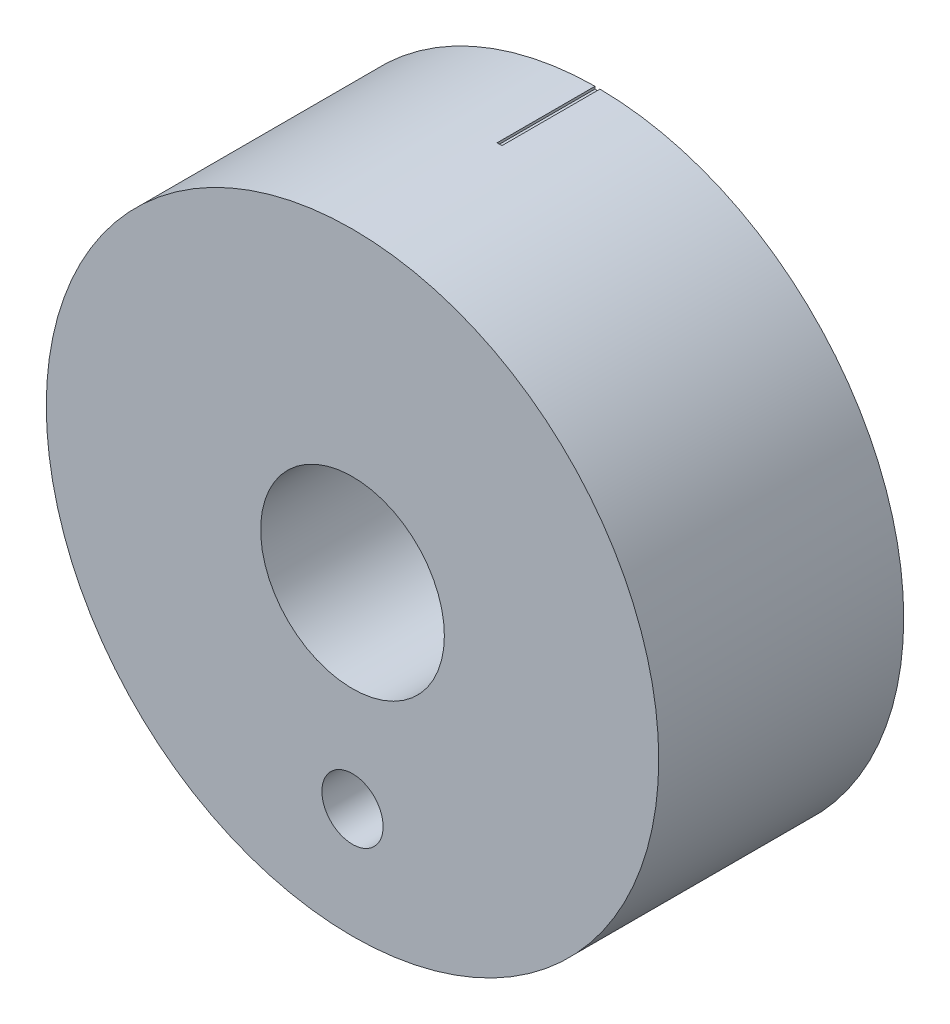
ISO-10303-21;
HEADER;
FILE_DESCRIPTION(('STEP AP214'),'2;1');
FILE_NAME('part.step','',(''),(''),'','','');
FILE_SCHEMA(('AUTOMOTIVE_DESIGN { 1 0 10303 214 1 1 1 1 }'));
ENDSEC;
DATA;
#1=APPLICATION_CONTEXT('core data for automotive mechanical design processes');
#2=APPLICATION_PROTOCOL_DEFINITION('international standard','automotive_design',2000,#1);
#3=PRODUCT_CONTEXT('',#1,'mechanical');
#4=PRODUCT('Part','Part','',(#3));
#5=PRODUCT_RELATED_PRODUCT_CATEGORY('part','',(#4));
#6=PRODUCT_DEFINITION_FORMATION('','',#4);
#7=PRODUCT_DEFINITION_CONTEXT('part definition',#1,'design');
#8=PRODUCT_DEFINITION('design','',#6,#7);
#9=PRODUCT_DEFINITION_SHAPE('','',#8);
#10=(LENGTH_UNIT() NAMED_UNIT(*) SI_UNIT(.MILLI.,.METRE.));
#11=(NAMED_UNIT(*) PLANE_ANGLE_UNIT() SI_UNIT($,.RADIAN.));
#12=(NAMED_UNIT(*) SI_UNIT($,.STERADIAN.) SOLID_ANGLE_UNIT());
#13=UNCERTAINTY_MEASURE_WITH_UNIT(LENGTH_MEASURE(1.E-05),#10,'distance_accuracy_value','');
#14=(GEOMETRIC_REPRESENTATION_CONTEXT(3) GLOBAL_UNCERTAINTY_ASSIGNED_CONTEXT((#13)) GLOBAL_UNIT_ASSIGNED_CONTEXT((#10,
#11,#12)) REPRESENTATION_CONTEXT('',''));
#15=CARTESIAN_POINT('',(0.,0.,0.));
#16=DIRECTION('',(0.,0.,1.));
#17=DIRECTION('',(1.,0.,0.));
#18=AXIS2_PLACEMENT_3D('',#15,#16,#17);
#19=CARTESIAN_POINT('',(0.,0.,-12.7));
#20=DIRECTION('',(0.,0.,1.));
#21=DIRECTION('',(1.,0.,0.));
#22=AXIS2_PLACEMENT_3D('',#19,#20,#21);
#23=CYLINDRICAL_SURFACE('',#22,15.875);
#24=CARTESIAN_POINT('',(0.,0.,0.));
#25=DIRECTION('',(0.,0.,1.));
#26=DIRECTION('',(1.,0.,0.));
#27=AXIS2_PLACEMENT_3D('',#24,#25,#26);
#28=CIRCLE('',#27,15.875);
#29=CARTESIAN_POINT('',(15.875,0.,0.));
#30=VERTEX_POINT('',#29);
#31=EDGE_CURVE('E104',#30,#30,#28,.T.);
#32=ORIENTED_EDGE('',*,*,#31,.F.);
#33=EDGE_LOOP('',(#32));
#34=FACE_BOUND('',#33,.T.);
#35=CARTESIAN_POINT('',(0.,0.,-7.62));
#36=DIRECTION('',(0.,0.,-1.));
#37=DIRECTION('',(-1.,0.,0.));
#38=AXIS2_PLACEMENT_3D('',#35,#36,#37);
#39=CIRCLE('',#38,15.875);
#40=CARTESIAN_POINT('',(0.127,15.8744919918717,-7.62));
#41=VERTEX_POINT('',#40);
#42=CARTESIAN_POINT('',(-0.127,15.8744919918717,-7.62));
#43=VERTEX_POINT('',#42);
#44=EDGE_CURVE('E11',#41,#43,#39,.F.);
#45=ORIENTED_EDGE('',*,*,#44,.T.);
#46=DIRECTION('',(0.,0.,1.));
#47=VECTOR('',#46,1.);
#48=CARTESIAN_POINT('',(-0.127,15.8744919918717,-12.7));
#49=LINE('',#48,#47);
#50=CARTESIAN_POINT('',(-0.127,15.8744919918717,-12.7));
#51=VERTEX_POINT('',#50);
#52=EDGE_CURVE('E56',#43,#51,#49,.F.);
#53=ORIENTED_EDGE('',*,*,#52,.T.);
#54=CARTESIAN_POINT('',(0.,0.,-12.7));
#55=DIRECTION('',(0.,0.,1.));
#56=DIRECTION('',(1.,0.,0.));
#57=AXIS2_PLACEMENT_3D('',#54,#55,#56);
#58=CIRCLE('',#57,15.875);
#59=CARTESIAN_POINT('',(0.127,15.8744919918717,-12.7));
#60=VERTEX_POINT('',#59);
#61=EDGE_CURVE('E107',#51,#60,#58,.T.);
#62=ORIENTED_EDGE('',*,*,#61,.T.);
#63=DIRECTION('',(0.,0.,1.));
#64=VECTOR('',#63,1.);
#65=CARTESIAN_POINT('',(0.127,15.8744919918717,-12.7));
#66=LINE('',#65,#64);
#67=EDGE_CURVE('E48',#60,#41,#66,.T.);
#68=ORIENTED_EDGE('',*,*,#67,.T.);
#69=EDGE_LOOP('',(#45,#53,#62,#68));
#70=FACE_BOUND('',#69,.T.);
#71=ADVANCED_FACE('F34',(#34,#70),#23,.T.);
#72=CARTESIAN_POINT('',(0.,0.,-12.7));
#73=DIRECTION('',(0.,0.,1.));
#74=DIRECTION('',(1.,0.,0.));
#75=AXIS2_PLACEMENT_3D('',#72,#73,#74);
#76=PLANE('',#75);
#77=CARTESIAN_POINT('',(0.,-10.16,-12.7));
#78=DIRECTION('',(0.,0.,-1.));
#79=DIRECTION('',(-1.,0.,0.));
#80=AXIS2_PLACEMENT_3D('',#77,#78,#79);
#81=CIRCLE('',#80,1.5875);
#82=CARTESIAN_POINT('',(-1.5875,-10.16,-12.7));
#83=VERTEX_POINT('',#82);
#84=EDGE_CURVE('E121',#83,#83,#81,.T.);
#85=ORIENTED_EDGE('',*,*,#84,.F.);
#86=EDGE_LOOP('',(#85));
#87=FACE_BOUND('',#86,.T.);
#88=CARTESIAN_POINT('',(0.,0.,-12.7));
#89=DIRECTION('',(0.,0.,1.));
#90=DIRECTION('',(1.,0.,0.));
#91=AXIS2_PLACEMENT_3D('',#88,#89,#90);
#92=CIRCLE('',#91,4.7625);
#93=CARTESIAN_POINT('',(4.7625,0.,-12.7));
#94=VERTEX_POINT('',#93);
#95=EDGE_CURVE('E101',#94,#94,#92,.T.);
#96=ORIENTED_EDGE('',*,*,#95,.T.);
#97=EDGE_LOOP('',(#96));
#98=FACE_BOUND('',#97,.T.);
#99=DIRECTION('',(0.,1.,0.));
#100=VECTOR('',#99,1.);
#101=CARTESIAN_POINT('',(-0.127,0.,-12.7));
#102=LINE('',#101,#100);
#103=CARTESIAN_POINT('',(-0.127,15.748,-12.7));
#104=VERTEX_POINT('',#103);
#105=EDGE_CURVE('E41',#104,#51,#102,.T.);
#106=ORIENTED_EDGE('',*,*,#105,.F.);
#107=DIRECTION('',(1.,0.,0.));
#108=VECTOR('',#107,1.);
#109=CARTESIAN_POINT('',(-0.127,15.748,-12.7));
#110=LINE('',#109,#108);
#111=CARTESIAN_POINT('',(0.127,15.748,-12.7));
#112=VERTEX_POINT('',#111);
#113=EDGE_CURVE('E92',#104,#112,#110,.T.);
#114=ORIENTED_EDGE('',*,*,#113,.T.);
#115=DIRECTION('',(0.,1.,0.));
#116=VECTOR('',#115,1.);
#117=CARTESIAN_POINT('',(0.127,15.748,-12.7));
#118=LINE('',#117,#116);
#119=EDGE_CURVE('E82',#112,#60,#118,.T.);
#120=ORIENTED_EDGE('',*,*,#119,.T.);
#121=ORIENTED_EDGE('',*,*,#61,.F.);
#122=EDGE_LOOP('',(#106,#114,#120,#121));
#123=FACE_BOUND('',#122,.T.);
#124=ADVANCED_FACE('F114',(#87,#98,#123),#76,.F.);
#125=CARTESIAN_POINT('',(0.,0.,0.));
#126=DIRECTION('',(0.,0.,1.));
#127=DIRECTION('',(1.,0.,0.));
#128=AXIS2_PLACEMENT_3D('',#125,#126,#127);
#129=PLANE('',#128);
#130=CARTESIAN_POINT('',(0.,-10.16,0.));
#131=DIRECTION('',(0.,0.,-1.));
#132=DIRECTION('',(-1.,0.,0.));
#133=AXIS2_PLACEMENT_3D('',#130,#131,#132);
#134=CIRCLE('',#133,1.5875);
#135=CARTESIAN_POINT('',(-1.5875,-10.16,0.));
#136=VERTEX_POINT('',#135);
#137=EDGE_CURVE('E115',#136,#136,#134,.T.);
#138=ORIENTED_EDGE('',*,*,#137,.T.);
#139=EDGE_LOOP('',(#138));
#140=FACE_BOUND('',#139,.T.);
#141=CARTESIAN_POINT('',(0.,0.,0.));
#142=DIRECTION('',(0.,0.,1.));
#143=DIRECTION('',(1.,0.,0.));
#144=AXIS2_PLACEMENT_3D('',#141,#142,#143);
#145=CIRCLE('',#144,4.7625);
#146=CARTESIAN_POINT('',(4.7625,0.,0.));
#147=VERTEX_POINT('',#146);
#148=EDGE_CURVE('E100',#147,#147,#145,.T.);
#149=ORIENTED_EDGE('',*,*,#148,.F.);
#150=EDGE_LOOP('',(#149));
#151=FACE_BOUND('',#150,.T.);
#152=ORIENTED_EDGE('',*,*,#31,.T.);
#153=EDGE_LOOP('',(#152));
#154=FACE_BOUND('',#153,.T.);
#155=ADVANCED_FACE('F129',(#140,#151,#154),#129,.T.);
#156=CARTESIAN_POINT('',(0.,0.,-12.7));
#157=DIRECTION('',(0.,0.,1.));
#158=DIRECTION('',(1.,0.,0.));
#159=AXIS2_PLACEMENT_3D('',#156,#157,#158);
#160=CYLINDRICAL_SURFACE('',#159,4.7625);
#161=ORIENTED_EDGE('',*,*,#95,.F.);
#162=EDGE_LOOP('',(#161));
#163=FACE_BOUND('',#162,.T.);
#164=ORIENTED_EDGE('',*,*,#148,.T.);
#165=EDGE_LOOP('',(#164));
#166=FACE_BOUND('',#165,.T.);
#167=ADVANCED_FACE('F133',(#163,#166),#160,.F.);
#168=CARTESIAN_POINT('',(-0.127,15.748,-7.62));
#169=DIRECTION('',(1.,0.,0.));
#170=DIRECTION('',(0.,0.,-1.));
#171=AXIS2_PLACEMENT_3D('',#168,#169,#170);
#172=PLANE('',#171);
#173=DIRECTION('',(0.,-1.,0.));
#174=VECTOR('',#173,1.);
#175=CARTESIAN_POINT('',(-0.127,15.748,-7.62));
#176=LINE('',#175,#174);
#177=CARTESIAN_POINT('',(-0.127,15.748,-7.62));
#178=VERTEX_POINT('',#177);
#179=EDGE_CURVE('E74',#43,#178,#176,.T.);
#180=ORIENTED_EDGE('',*,*,#179,.T.);
#181=DIRECTION('',(0.,0.,-1.));
#182=VECTOR('',#181,1.);
#183=CARTESIAN_POINT('',(-0.127,15.748,-7.62));
#184=LINE('',#183,#182);
#185=EDGE_CURVE('E78',#178,#104,#184,.T.);
#186=ORIENTED_EDGE('',*,*,#185,.T.);
#187=ORIENTED_EDGE('',*,*,#105,.T.);
#188=ORIENTED_EDGE('',*,*,#52,.F.);
#189=EDGE_LOOP('',(#180,#186,#187,#188));
#190=FACE_BOUND('',#189,.T.);
#191=ADVANCED_FACE('F76',(#190),#172,.T.);
#192=CARTESIAN_POINT('',(-0.127,15.748,-7.62));
#193=DIRECTION('',(0.,1.,0.));
#194=DIRECTION('',(0.,0.,1.));
#195=AXIS2_PLACEMENT_3D('',#192,#193,#194);
#196=PLANE('',#195);
#197=ORIENTED_EDGE('',*,*,#113,.F.);
#198=ORIENTED_EDGE('',*,*,#185,.F.);
#199=DIRECTION('',(1.,0.,0.));
#200=VECTOR('',#199,1.);
#201=CARTESIAN_POINT('',(-0.127,15.748,-7.62));
#202=LINE('',#201,#200);
#203=CARTESIAN_POINT('',(0.127,15.748,-7.62));
#204=VERTEX_POINT('',#203);
#205=EDGE_CURVE('E81',#178,#204,#202,.T.);
#206=ORIENTED_EDGE('',*,*,#205,.T.);
#207=DIRECTION('',(0.,0.,-1.));
#208=VECTOR('',#207,1.);
#209=CARTESIAN_POINT('',(0.127,15.748,-7.62));
#210=LINE('',#209,#208);
#211=EDGE_CURVE('E93',#204,#112,#210,.T.);
#212=ORIENTED_EDGE('',*,*,#211,.T.);
#213=EDGE_LOOP('',(#197,#198,#206,#212));
#214=FACE_BOUND('',#213,.T.);
#215=ADVANCED_FACE('F90',(#214),#196,.T.);
#216=CARTESIAN_POINT('',(0.127,15.748,-7.62));
#217=DIRECTION('',(-1.,0.,0.));
#218=DIRECTION('',(0.,0.,1.));
#219=AXIS2_PLACEMENT_3D('',#216,#217,#218);
#220=PLANE('',#219);
#221=ORIENTED_EDGE('',*,*,#119,.F.);
#222=ORIENTED_EDGE('',*,*,#211,.F.);
#223=DIRECTION('',(0.,1.,0.));
#224=VECTOR('',#223,1.);
#225=CARTESIAN_POINT('',(0.127,15.748,-7.62));
#226=LINE('',#225,#224);
#227=EDGE_CURVE('E86',#204,#41,#226,.T.);
#228=ORIENTED_EDGE('',*,*,#227,.T.);
#229=ORIENTED_EDGE('',*,*,#67,.F.);
#230=EDGE_LOOP('',(#221,#222,#228,#229));
#231=FACE_BOUND('',#230,.T.);
#232=ADVANCED_FACE('F173',(#231),#220,.T.);
#233=CARTESIAN_POINT('',(0.,0.,-7.62));
#234=DIRECTION('',(0.,0.,-1.));
#235=DIRECTION('',(-1.,0.,0.));
#236=AXIS2_PLACEMENT_3D('',#233,#234,#235);
#237=PLANE('',#236);
#238=ORIENTED_EDGE('',*,*,#227,.F.);
#239=ORIENTED_EDGE('',*,*,#205,.F.);
#240=ORIENTED_EDGE('',*,*,#179,.F.);
#241=ORIENTED_EDGE('',*,*,#44,.F.);
#242=EDGE_LOOP('',(#238,#239,#240,#241));
#243=FACE_BOUND('',#242,.T.);
#244=ADVANCED_FACE('F85',(#243),#237,.T.);
#245=CARTESIAN_POINT('',(0.,-10.16,-12.7));
#246=DIRECTION('',(0.,0.,-1.));
#247=DIRECTION('',(-1.,0.,0.));
#248=AXIS2_PLACEMENT_3D('',#245,#246,#247);
#249=CYLINDRICAL_SURFACE('',#248,1.5875);
#250=ORIENTED_EDGE('',*,*,#137,.F.);
#251=EDGE_LOOP('',(#250));
#252=FACE_BOUND('',#251,.T.);
#253=ORIENTED_EDGE('',*,*,#84,.T.);
#254=EDGE_LOOP('',(#253));
#255=FACE_BOUND('',#254,.T.);
#256=ADVANCED_FACE('F125',(#252,#255),#249,.F.);
#257=CLOSED_SHELL('',(#71,#124,#155,#167,#191,#215,#232,#244,#256));
#258=MANIFOLD_SOLID_BREP('B2',#257);
#259=ADVANCED_BREP_SHAPE_REPRESENTATION('',(#18,#258),#14);
#260=SHAPE_DEFINITION_REPRESENTATION(#9,#259);
ENDSEC;
END-ISO-10303-21;
